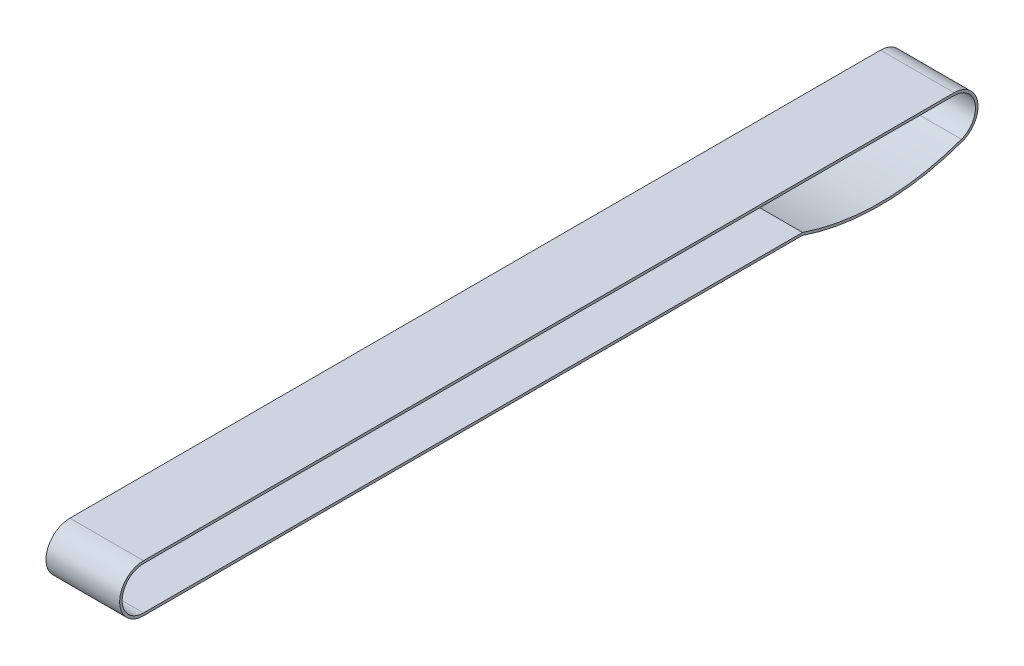
ISO-10303-21;
HEADER;
FILE_DESCRIPTION(('STEP AP214'),'2;1');
FILE_NAME('part.step','',(''),(''),'','','');
FILE_SCHEMA(('AUTOMOTIVE_DESIGN { 1 0 10303 214 1 1 1 1 }'));
ENDSEC;
DATA;
#1=APPLICATION_CONTEXT('core data for automotive mechanical design processes');
#2=APPLICATION_PROTOCOL_DEFINITION('international standard','automotive_design',2000,#1);
#3=PRODUCT_CONTEXT('',#1,'mechanical');
#4=PRODUCT('Part','Part','',(#3));
#5=PRODUCT_RELATED_PRODUCT_CATEGORY('part','',(#4));
#6=PRODUCT_DEFINITION_FORMATION('','',#4);
#7=PRODUCT_DEFINITION_CONTEXT('part definition',#1,'design');
#8=PRODUCT_DEFINITION('design','',#6,#7);
#9=PRODUCT_DEFINITION_SHAPE('','',#8);
#10=(LENGTH_UNIT() NAMED_UNIT(*) SI_UNIT(.MILLI.,.METRE.));
#11=(NAMED_UNIT(*) PLANE_ANGLE_UNIT() SI_UNIT($,.RADIAN.));
#12=(NAMED_UNIT(*) SI_UNIT($,.STERADIAN.) SOLID_ANGLE_UNIT());
#13=UNCERTAINTY_MEASURE_WITH_UNIT(LENGTH_MEASURE(1.E-05),#10,'distance_accuracy_value','');
#14=(GEOMETRIC_REPRESENTATION_CONTEXT(3) GLOBAL_UNCERTAINTY_ASSIGNED_CONTEXT((#13)) GLOBAL_UNIT_ASSIGNED_CONTEXT((#10,
#11,#12)) REPRESENTATION_CONTEXT('',''));
#15=CARTESIAN_POINT('',(0.,0.,0.));
#16=DIRECTION('',(0.,0.,1.));
#17=DIRECTION('',(1.,0.,0.));
#18=AXIS2_PLACEMENT_3D('',#15,#16,#17);
#19=CARTESIAN_POINT('',(127.5,0.,-2806.7));
#20=DIRECTION('',(-1.,0.,0.));
#21=DIRECTION('',(0.,0.,1.));
#22=AXIS2_PLACEMENT_3D('',#19,#20,#21);
#23=CYLINDRICAL_SURFACE('',#22,73.9999999999998);
#24=DIRECTION('',(-1.,0.,0.));
#25=VECTOR('',#24,1.);
#26=CARTESIAN_POINT('',(127.5,-69.5720826491919,-2831.91359387025));
#27=LINE('',#26,#25);
#28=CARTESIAN_POINT('',(-127.5,-69.5720826491919,-2831.91359387025));
#29=VERTEX_POINT('',#28);
#30=CARTESIAN_POINT('',(127.5,-69.5720826491919,-2831.91359387025));
#31=VERTEX_POINT('',#30);
#32=EDGE_CURVE('E90',#29,#31,#27,.F.);
#33=ORIENTED_EDGE('',*,*,#32,.T.);
#34=CARTESIAN_POINT('',(127.5,0.,-2806.7));
#35=DIRECTION('',(-1.,0.,0.));
#36=DIRECTION('',(0.,0.,1.));
#37=AXIS2_PLACEMENT_3D('',#34,#35,#36);
#38=CIRCLE('',#37,73.9999999999998);
#39=CARTESIAN_POINT('',(127.5,74.,-2806.7));
#40=VERTEX_POINT('',#39);
#41=EDGE_CURVE('E150',#40,#31,#38,.T.);
#42=ORIENTED_EDGE('',*,*,#41,.F.);
#43=DIRECTION('',(1.,0.,0.));
#44=VECTOR('',#43,1.);
#45=CARTESIAN_POINT('',(127.5,74.,-2806.7));
#46=LINE('',#45,#44);
#47=CARTESIAN_POINT('',(-127.5,74.,-2806.7));
#48=VERTEX_POINT('',#47);
#49=EDGE_CURVE('E127',#40,#48,#46,.F.);
#50=ORIENTED_EDGE('',*,*,#49,.T.);
#51=CARTESIAN_POINT('',(-127.5,0.,-2806.7));
#52=DIRECTION('',(-1.,0.,0.));
#53=DIRECTION('',(0.,0.,1.));
#54=AXIS2_PLACEMENT_3D('',#51,#52,#53);
#55=CIRCLE('',#54,73.9999999999998);
#56=EDGE_CURVE('E158',#48,#29,#55,.T.);
#57=ORIENTED_EDGE('',*,*,#56,.T.);
#58=EDGE_LOOP('',(#33,#42,#50,#57));
#59=FACE_BOUND('',#58,.T.);
#60=ADVANCED_FACE('F16',(#59),#23,.F.);
#61=CARTESIAN_POINT('',(127.5,706.527610932691,-2550.64757836989));
#62=DIRECTION('',(-1.,0.,0.));
#63=DIRECTION('',(0.,0.,1.));
#64=AXIS2_PLACEMENT_3D('',#61,#62,#63);
#65=CYLINDRICAL_SURFACE('',#64,825.49458257056);
#66=DIRECTION('',(1.,0.,0.));
#67=VECTOR('',#66,1.);
#68=CARTESIAN_POINT('',(127.5,-73.9999999999999,-2281.91359387025));
#69=LINE('',#68,#67);
#70=CARTESIAN_POINT('',(127.5,-73.9999999999998,-2281.91359387025));
#71=VERTEX_POINT('',#70);
#72=CARTESIAN_POINT('',(-127.5,-73.9999999999998,-2281.91359387025));
#73=VERTEX_POINT('',#72);
#74=EDGE_CURVE('E95',#71,#73,#69,.F.);
#75=ORIENTED_EDGE('',*,*,#74,.F.);
#76=CARTESIAN_POINT('',(127.5,706.527610932691,-2550.64757836989));
#77=DIRECTION('',(-1.,0.,0.));
#78=DIRECTION('',(0.,0.,1.));
#79=AXIS2_PLACEMENT_3D('',#76,#77,#78);
#80=CIRCLE('',#79,825.49458257056);
#81=EDGE_CURVE('E148',#31,#71,#80,.T.);
#82=ORIENTED_EDGE('',*,*,#81,.F.);
#83=ORIENTED_EDGE('',*,*,#32,.F.);
#84=CARTESIAN_POINT('',(-127.5,706.527610932691,-2550.64757836989));
#85=DIRECTION('',(-1.,0.,0.));
#86=DIRECTION('',(0.,0.,1.));
#87=AXIS2_PLACEMENT_3D('',#84,#85,#86);
#88=CIRCLE('',#87,825.49458257056);
#89=EDGE_CURVE('E19',#29,#73,#88,.T.);
#90=ORIENTED_EDGE('',*,*,#89,.T.);
#91=EDGE_LOOP('',(#75,#82,#83,#90));
#92=FACE_BOUND('',#91,.T.);
#93=ADVANCED_FACE('F94',(#92),#65,.F.);
#94=CARTESIAN_POINT('',(127.5,-74.,0.));
#95=DIRECTION('',(0.,1.,0.));
#96=DIRECTION('',(0.,0.,1.));
#97=AXIS2_PLACEMENT_3D('',#94,#95,#96);
#98=PLANE('',#97);
#99=DIRECTION('',(0.,0.,-1.));
#100=VECTOR('',#99,1.);
#101=CARTESIAN_POINT('',(127.5,-73.9999999999999,0.));
#102=LINE('',#101,#100);
#103=CARTESIAN_POINT('',(127.5,-73.9999999999999,0.));
#104=VERTEX_POINT('',#103);
#105=EDGE_CURVE('E108',#71,#104,#102,.F.);
#106=ORIENTED_EDGE('',*,*,#105,.F.);
#107=ORIENTED_EDGE('',*,*,#74,.T.);
#108=DIRECTION('',(0.,0.,-1.));
#109=VECTOR('',#108,1.);
#110=CARTESIAN_POINT('',(-127.5,-73.9999999999999,0.));
#111=LINE('',#110,#109);
#112=CARTESIAN_POINT('',(-127.5,-73.9999999999999,0.));
#113=VERTEX_POINT('',#112);
#114=EDGE_CURVE('E100',#73,#113,#111,.F.);
#115=ORIENTED_EDGE('',*,*,#114,.T.);
#116=DIRECTION('',(-1.,0.,0.));
#117=VECTOR('',#116,1.);
#118=CARTESIAN_POINT('',(127.5,-74.,0.));
#119=LINE('',#118,#117);
#120=EDGE_CURVE('E110',#113,#104,#119,.F.);
#121=ORIENTED_EDGE('',*,*,#120,.T.);
#122=EDGE_LOOP('',(#106,#107,#115,#121));
#123=FACE_BOUND('',#122,.T.);
#124=ADVANCED_FACE('F104',(#123),#98,.T.);
#125=CARTESIAN_POINT('',(127.5,0.,0.));
#126=DIRECTION('',(-1.,0.,0.));
#127=DIRECTION('',(0.,0.,1.));
#128=AXIS2_PLACEMENT_3D('',#125,#126,#127);
#129=CYLINDRICAL_SURFACE('',#128,74.);
#130=CARTESIAN_POINT('',(127.5,0.,0.));
#131=DIRECTION('',(-1.,0.,0.));
#132=DIRECTION('',(0.,0.,1.));
#133=AXIS2_PLACEMENT_3D('',#130,#131,#132);
#134=CIRCLE('',#133,74.);
#135=CARTESIAN_POINT('',(127.5,74.,0.));
#136=VERTEX_POINT('',#135);
#137=EDGE_CURVE('E144',#104,#136,#134,.T.);
#138=ORIENTED_EDGE('',*,*,#137,.F.);
#139=ORIENTED_EDGE('',*,*,#120,.F.);
#140=CARTESIAN_POINT('',(-127.5,0.,0.));
#141=DIRECTION('',(-1.,0.,0.));
#142=DIRECTION('',(0.,0.,1.));
#143=AXIS2_PLACEMENT_3D('',#140,#141,#142);
#144=CIRCLE('',#143,74.);
#145=CARTESIAN_POINT('',(-127.5,74.,0.));
#146=VERTEX_POINT('',#145);
#147=EDGE_CURVE('E114',#113,#146,#144,.T.);
#148=ORIENTED_EDGE('',*,*,#147,.T.);
#149=DIRECTION('',(1.,0.,0.));
#150=VECTOR('',#149,1.);
#151=CARTESIAN_POINT('',(127.5,74.,0.));
#152=LINE('',#151,#150);
#153=EDGE_CURVE('E129',#146,#136,#152,.T.);
#154=ORIENTED_EDGE('',*,*,#153,.T.);
#155=EDGE_LOOP('',(#138,#139,#148,#154));
#156=FACE_BOUND('',#155,.T.);
#157=ADVANCED_FACE('F168',(#156),#129,.F.);
#158=CARTESIAN_POINT('',(127.5,74.,0.));
#159=DIRECTION('',(0.,1.,0.));
#160=DIRECTION('',(0.,0.,1.));
#161=AXIS2_PLACEMENT_3D('',#158,#159,#160);
#162=PLANE('',#161);
#163=ORIENTED_EDGE('',*,*,#49,.F.);
#164=DIRECTION('',(0.,0.,-1.));
#165=VECTOR('',#164,1.);
#166=CARTESIAN_POINT('',(127.5,74.,0.));
#167=LINE('',#166,#165);
#168=EDGE_CURVE('E147',#136,#40,#167,.T.);
#169=ORIENTED_EDGE('',*,*,#168,.F.);
#170=ORIENTED_EDGE('',*,*,#153,.F.);
#171=DIRECTION('',(0.,0.,-1.));
#172=VECTOR('',#171,1.);
#173=CARTESIAN_POINT('',(-127.5,74.,0.));
#174=LINE('',#173,#172);
#175=EDGE_CURVE('E116',#146,#48,#174,.T.);
#176=ORIENTED_EDGE('',*,*,#175,.T.);
#177=EDGE_LOOP('',(#163,#169,#170,#176));
#178=FACE_BOUND('',#177,.T.);
#179=ADVANCED_FACE('F164',(#178),#162,.F.);
#180=CARTESIAN_POINT('',(127.5,-82.7,0.));
#181=DIRECTION('',(0.,1.,0.));
#182=DIRECTION('',(0.,0.,1.));
#183=AXIS2_PLACEMENT_3D('',#180,#181,#182);
#184=PLANE('',#183);
#185=DIRECTION('',(-1.,0.,0.));
#186=VECTOR('',#185,1.);
#187=CARTESIAN_POINT('',(127.5,-82.7000000000001,-2280.46175392392));
#188=LINE('',#187,#186);
#189=CARTESIAN_POINT('',(127.5,-82.7,-2280.46175392392));
#190=VERTEX_POINT('',#189);
#191=CARTESIAN_POINT('',(-127.5,-82.7,-2280.46175392392));
#192=VERTEX_POINT('',#191);
#193=EDGE_CURVE('E101',#190,#192,#188,.T.);
#194=ORIENTED_EDGE('',*,*,#193,.F.);
#195=DIRECTION('',(0.,0.,-1.));
#196=VECTOR('',#195,1.);
#197=CARTESIAN_POINT('',(127.5,-82.7,0.));
#198=LINE('',#197,#196);
#199=CARTESIAN_POINT('',(127.5,-82.7,0.));
#200=VERTEX_POINT('',#199);
#201=EDGE_CURVE('E143',#200,#190,#198,.T.);
#202=ORIENTED_EDGE('',*,*,#201,.F.);
#203=DIRECTION('',(-1.,0.,0.));
#204=VECTOR('',#203,1.);
#205=CARTESIAN_POINT('',(127.5,-82.7,0.));
#206=LINE('',#205,#204);
#207=CARTESIAN_POINT('',(-127.5,-82.7,0.));
#208=VERTEX_POINT('',#207);
#209=EDGE_CURVE('E124',#208,#200,#206,.F.);
#210=ORIENTED_EDGE('',*,*,#209,.F.);
#211=DIRECTION('',(0.,0.,-1.));
#212=VECTOR('',#211,1.);
#213=CARTESIAN_POINT('',(-127.5,-82.7,0.));
#214=LINE('',#213,#212);
#215=EDGE_CURVE('E155',#208,#192,#214,.T.);
#216=ORIENTED_EDGE('',*,*,#215,.T.);
#217=EDGE_LOOP('',(#194,#202,#210,#216));
#218=FACE_BOUND('',#217,.T.);
#219=ADVANCED_FACE('F186',(#218),#184,.F.);
#220=CARTESIAN_POINT('',(127.5,706.527610932691,-2550.64757836989));
#221=DIRECTION('',(-1.,0.,0.));
#222=DIRECTION('',(0.,0.,1.));
#223=AXIS2_PLACEMENT_3D('',#220,#221,#222);
#224=CYLINDRICAL_SURFACE('',#223,834.19458257056);
#225=CARTESIAN_POINT('',(127.5,706.527610932691,-2550.64757836989));
#226=DIRECTION('',(-1.,0.,0.));
#227=DIRECTION('',(0.,0.,1.));
#228=AXIS2_PLACEMENT_3D('',#225,#226,#227);
#229=CIRCLE('',#228,834.19458257056);
#230=CARTESIAN_POINT('',(127.5,-77.7515031768672,-2834.87789477121));
#231=VERTEX_POINT('',#230);
#232=EDGE_CURVE('E141',#190,#231,#229,.F.);
#233=ORIENTED_EDGE('',*,*,#232,.F.);
#234=ORIENTED_EDGE('',*,*,#193,.T.);
#235=CARTESIAN_POINT('',(-127.5,706.527610932691,-2550.64757836989));
#236=DIRECTION('',(-1.,0.,0.));
#237=DIRECTION('',(0.,0.,1.));
#238=AXIS2_PLACEMENT_3D('',#235,#236,#237);
#239=CIRCLE('',#238,834.19458257056);
#240=CARTESIAN_POINT('',(-127.5,-77.7515031768672,-2834.87789477121));
#241=VERTEX_POINT('',#240);
#242=EDGE_CURVE('E156',#192,#241,#239,.F.);
#243=ORIENTED_EDGE('',*,*,#242,.T.);
#244=DIRECTION('',(-1.,0.,0.));
#245=VECTOR('',#244,1.);
#246=CARTESIAN_POINT('',(127.5,-77.7515031768674,-2834.87789477121));
#247=LINE('',#246,#245);
#248=EDGE_CURVE('E120',#231,#241,#247,.T.);
#249=ORIENTED_EDGE('',*,*,#248,.F.);
#250=EDGE_LOOP('',(#233,#234,#243,#249));
#251=FACE_BOUND('',#250,.T.);
#252=ADVANCED_FACE('F192',(#251),#224,.T.);
#253=CARTESIAN_POINT('',(-127.5,0.,0.));
#254=DIRECTION('',(1.,0.,0.));
#255=DIRECTION('',(0.,0.,-1.));
#256=AXIS2_PLACEMENT_3D('',#253,#254,#255);
#257=PLANE('',#256);
#258=ORIENTED_EDGE('',*,*,#215,.F.);
#259=CARTESIAN_POINT('',(-127.5,0.,0.));
#260=DIRECTION('',(-1.,0.,0.));
#261=DIRECTION('',(0.,0.,1.));
#262=AXIS2_PLACEMENT_3D('',#259,#260,#261);
#263=CIRCLE('',#262,82.7);
#264=CARTESIAN_POINT('',(-127.5,82.7,0.));
#265=VERTEX_POINT('',#264);
#266=EDGE_CURVE('E153',#265,#208,#263,.F.);
#267=ORIENTED_EDGE('',*,*,#266,.F.);
#268=DIRECTION('',(0.,0.,1.));
#269=VECTOR('',#268,1.);
#270=CARTESIAN_POINT('',(-127.5,82.7,0.));
#271=LINE('',#270,#269);
#272=CARTESIAN_POINT('',(-127.5,82.7,-2806.7));
#273=VERTEX_POINT('',#272);
#274=EDGE_CURVE('E123',#273,#265,#271,.T.);
#275=ORIENTED_EDGE('',*,*,#274,.F.);
#276=CARTESIAN_POINT('',(-127.5,0.,-2806.7));
#277=DIRECTION('',(-1.,0.,0.));
#278=DIRECTION('',(0.,0.,1.));
#279=AXIS2_PLACEMENT_3D('',#276,#277,#278);
#280=CIRCLE('',#279,82.7);
#281=EDGE_CURVE('E135',#241,#273,#280,.F.);
#282=ORIENTED_EDGE('',*,*,#281,.F.);
#283=ORIENTED_EDGE('',*,*,#242,.F.);
#284=EDGE_LOOP('',(#258,#267,#275,#282,#283));
#285=FACE_BOUND('',#284,.T.);
#286=ORIENTED_EDGE('',*,*,#175,.F.);
#287=ORIENTED_EDGE('',*,*,#147,.F.);
#288=ORIENTED_EDGE('',*,*,#114,.F.);
#289=ORIENTED_EDGE('',*,*,#89,.F.);
#290=ORIENTED_EDGE('',*,*,#56,.F.);
#291=EDGE_LOOP('',(#286,#287,#288,#289,#290));
#292=FACE_BOUND('',#291,.T.);
#293=ADVANCED_FACE('F113',(#285,#292),#257,.F.);
#294=CARTESIAN_POINT('',(127.5,0.,0.));
#295=DIRECTION('',(-1.,0.,0.));
#296=DIRECTION('',(0.,0.,1.));
#297=AXIS2_PLACEMENT_3D('',#294,#295,#296);
#298=CYLINDRICAL_SURFACE('',#297,82.7);
#299=DIRECTION('',(1.,0.,0.));
#300=VECTOR('',#299,1.);
#301=CARTESIAN_POINT('',(127.5,82.7,0.));
#302=LINE('',#301,#300);
#303=CARTESIAN_POINT('',(127.5,82.7,0.));
#304=VERTEX_POINT('',#303);
#305=EDGE_CURVE('E175',#265,#304,#302,.T.);
#306=ORIENTED_EDGE('',*,*,#305,.F.);
#307=ORIENTED_EDGE('',*,*,#266,.T.);
#308=ORIENTED_EDGE('',*,*,#209,.T.);
#309=CARTESIAN_POINT('',(127.5,0.,0.));
#310=DIRECTION('',(-1.,0.,0.));
#311=DIRECTION('',(0.,0.,1.));
#312=AXIS2_PLACEMENT_3D('',#309,#310,#311);
#313=CIRCLE('',#312,82.7);
#314=EDGE_CURVE('E138',#304,#200,#313,.F.);
#315=ORIENTED_EDGE('',*,*,#314,.F.);
#316=EDGE_LOOP('',(#306,#307,#308,#315));
#317=FACE_BOUND('',#316,.T.);
#318=ADVANCED_FACE('F213',(#317),#298,.T.);
#319=CARTESIAN_POINT('',(127.5,0.,0.));
#320=DIRECTION('',(1.,0.,0.));
#321=DIRECTION('',(0.,0.,-1.));
#322=AXIS2_PLACEMENT_3D('',#319,#320,#321);
#323=PLANE('',#322);
#324=DIRECTION('',(0.,0.,1.));
#325=VECTOR('',#324,1.);
#326=CARTESIAN_POINT('',(127.5,82.7,0.));
#327=LINE('',#326,#325);
#328=CARTESIAN_POINT('',(127.5,82.7,-2806.7));
#329=VERTEX_POINT('',#328);
#330=EDGE_CURVE('E25',#304,#329,#327,.F.);
#331=ORIENTED_EDGE('',*,*,#330,.F.);
#332=ORIENTED_EDGE('',*,*,#314,.T.);
#333=ORIENTED_EDGE('',*,*,#201,.T.);
#334=ORIENTED_EDGE('',*,*,#232,.T.);
#335=CARTESIAN_POINT('',(127.5,0.,-2806.7));
#336=DIRECTION('',(-1.,0.,0.));
#337=DIRECTION('',(0.,0.,1.));
#338=AXIS2_PLACEMENT_3D('',#335,#336,#337);
#339=CIRCLE('',#338,82.7);
#340=EDGE_CURVE('E34',#329,#231,#339,.T.);
#341=ORIENTED_EDGE('',*,*,#340,.F.);
#342=EDGE_LOOP('',(#331,#332,#333,#334,#341));
#343=FACE_BOUND('',#342,.T.);
#344=ORIENTED_EDGE('',*,*,#137,.T.);
#345=ORIENTED_EDGE('',*,*,#168,.T.);
#346=ORIENTED_EDGE('',*,*,#41,.T.);
#347=ORIENTED_EDGE('',*,*,#81,.T.);
#348=ORIENTED_EDGE('',*,*,#105,.T.);
#349=EDGE_LOOP('',(#344,#345,#346,#347,#348));
#350=FACE_BOUND('',#349,.T.);
#351=ADVANCED_FACE('F170',(#343,#350),#323,.T.);
#352=CARTESIAN_POINT('',(127.5,0.,-2806.7));
#353=DIRECTION('',(-1.,0.,0.));
#354=DIRECTION('',(0.,0.,1.));
#355=AXIS2_PLACEMENT_3D('',#352,#353,#354);
#356=CYLINDRICAL_SURFACE('',#355,82.7);
#357=ORIENTED_EDGE('',*,*,#340,.T.);
#358=ORIENTED_EDGE('',*,*,#248,.T.);
#359=ORIENTED_EDGE('',*,*,#281,.T.);
#360=DIRECTION('',(1.,0.,0.));
#361=VECTOR('',#360,1.);
#362=CARTESIAN_POINT('',(127.5,82.7,-2806.7));
#363=LINE('',#362,#361);
#364=EDGE_CURVE('E11',#329,#273,#363,.F.);
#365=ORIENTED_EDGE('',*,*,#364,.F.);
#366=EDGE_LOOP('',(#357,#358,#359,#365));
#367=FACE_BOUND('',#366,.T.);
#368=ADVANCED_FACE('F201',(#367),#356,.T.);
#369=CARTESIAN_POINT('',(127.5,82.7,0.));
#370=DIRECTION('',(0.,1.,0.));
#371=DIRECTION('',(0.,0.,1.));
#372=AXIS2_PLACEMENT_3D('',#369,#370,#371);
#373=PLANE('',#372);
#374=ORIENTED_EDGE('',*,*,#330,.T.);
#375=ORIENTED_EDGE('',*,*,#364,.T.);
#376=ORIENTED_EDGE('',*,*,#274,.T.);
#377=ORIENTED_EDGE('',*,*,#305,.T.);
#378=EDGE_LOOP('',(#374,#375,#376,#377));
#379=FACE_BOUND('',#378,.T.);
#380=ADVANCED_FACE('F199',(#379),#373,.T.);
#381=CLOSED_SHELL('',(#60,#93,#124,#157,#179,#219,#252,#293,#318,#351,#368,#380));
#382=MANIFOLD_SOLID_BREP('B1',#381);
#383=ADVANCED_BREP_SHAPE_REPRESENTATION('',(#18,#382),#14);
#384=SHAPE_DEFINITION_REPRESENTATION(#9,#383);
ENDSEC;
END-ISO-10303-21;
